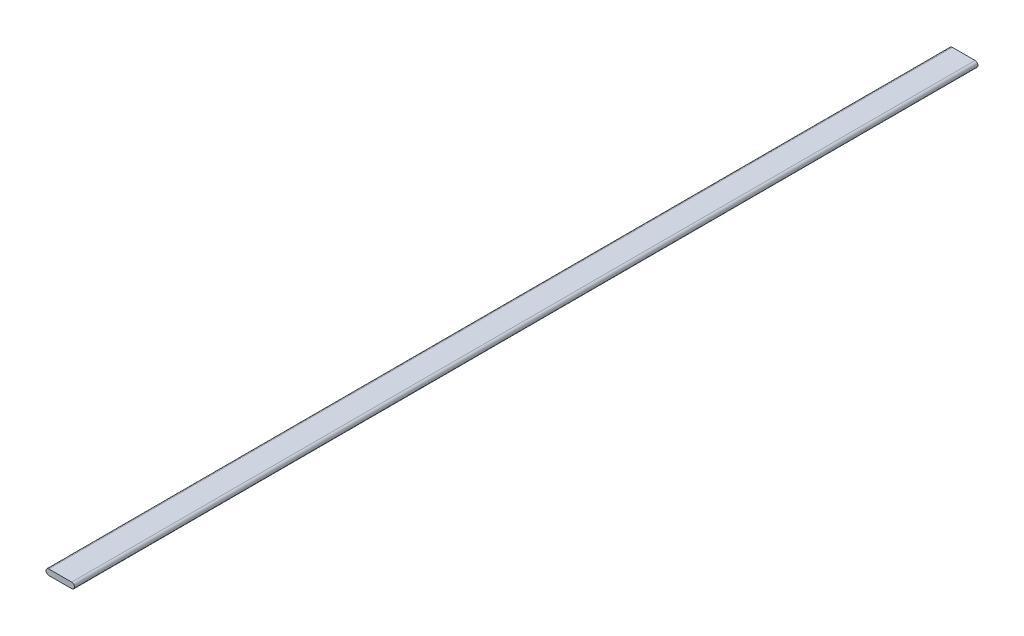
ISO-10303-21;
HEADER;
FILE_DESCRIPTION(('STEP AP214'),'2;1');
FILE_NAME('part.step','',(''),(''),'','','');
FILE_SCHEMA(('AUTOMOTIVE_DESIGN { 1 0 10303 214 1 1 1 1 }'));
ENDSEC;
DATA;
#1=APPLICATION_CONTEXT('core data for automotive mechanical design processes');
#2=APPLICATION_PROTOCOL_DEFINITION('international standard','automotive_design',2000,#1);
#3=PRODUCT_CONTEXT('',#1,'mechanical');
#4=PRODUCT('Part','Part','',(#3));
#5=PRODUCT_RELATED_PRODUCT_CATEGORY('part','',(#4));
#6=PRODUCT_DEFINITION_FORMATION('','',#4);
#7=PRODUCT_DEFINITION_CONTEXT('part definition',#1,'design');
#8=PRODUCT_DEFINITION('design','',#6,#7);
#9=PRODUCT_DEFINITION_SHAPE('','',#8);
#10=(LENGTH_UNIT() NAMED_UNIT(*) SI_UNIT(.MILLI.,.METRE.));
#11=(NAMED_UNIT(*) PLANE_ANGLE_UNIT() SI_UNIT($,.RADIAN.));
#12=(NAMED_UNIT(*) SI_UNIT($,.STERADIAN.) SOLID_ANGLE_UNIT());
#13=UNCERTAINTY_MEASURE_WITH_UNIT(LENGTH_MEASURE(1.E-05),#10,'distance_accuracy_value','');
#14=(GEOMETRIC_REPRESENTATION_CONTEXT(3) GLOBAL_UNCERTAINTY_ASSIGNED_CONTEXT((#13)) GLOBAL_UNIT_ASSIGNED_CONTEXT((#10,
#11,#12)) REPRESENTATION_CONTEXT('',''));
#15=CARTESIAN_POINT('',(0.,0.,0.));
#16=DIRECTION('',(0.,0.,1.));
#17=DIRECTION('',(1.,0.,0.));
#18=AXIS2_PLACEMENT_3D('',#15,#16,#17);
#19=CARTESIAN_POINT('',(-1.016,0.,-40.259));
#20=DIRECTION('',(0.,0.,1.));
#21=DIRECTION('',(1.,0.,0.));
#22=AXIS2_PLACEMENT_3D('',#19,#20,#21);
#23=CYLINDRICAL_SURFACE('',#22,0.254);
#24=DIRECTION('',(0.,0.,1.));
#25=VECTOR('',#24,1.);
#26=CARTESIAN_POINT('',(-1.016,-0.254,-40.259));
#27=LINE('',#26,#25);
#28=CARTESIAN_POINT('',(-1.016,-0.254,-40.259));
#29=VERTEX_POINT('',#28);
#30=CARTESIAN_POINT('',(-1.016,-0.254,40.259));
#31=VERTEX_POINT('',#30);
#32=EDGE_CURVE('E37',#29,#31,#27,.T.);
#33=ORIENTED_EDGE('',*,*,#32,.T.);
#34=CARTESIAN_POINT('',(-1.016,0.,40.259));
#35=DIRECTION('',(0.,0.,1.));
#36=DIRECTION('',(1.,0.,0.));
#37=AXIS2_PLACEMENT_3D('',#34,#35,#36);
#38=CIRCLE('',#37,0.254);
#39=CARTESIAN_POINT('',(-1.016,0.254,40.259));
#40=VERTEX_POINT('',#39);
#41=EDGE_CURVE('E74',#40,#31,#38,.T.);
#42=ORIENTED_EDGE('',*,*,#41,.F.);
#43=DIRECTION('',(0.,0.,1.));
#44=VECTOR('',#43,1.);
#45=CARTESIAN_POINT('',(-1.016,0.254,-40.259));
#46=LINE('',#45,#44);
#47=CARTESIAN_POINT('',(-1.016,0.254,-40.259));
#48=VERTEX_POINT('',#47);
#49=EDGE_CURVE('E11',#48,#40,#46,.T.);
#50=ORIENTED_EDGE('',*,*,#49,.F.);
#51=CARTESIAN_POINT('',(-1.016,0.,-40.259));
#52=DIRECTION('',(0.,0.,1.));
#53=DIRECTION('',(1.,0.,0.));
#54=AXIS2_PLACEMENT_3D('',#51,#52,#53);
#55=CIRCLE('',#54,0.254);
#56=EDGE_CURVE('E75',#48,#29,#55,.T.);
#57=ORIENTED_EDGE('',*,*,#56,.T.);
#58=EDGE_LOOP('',(#33,#42,#50,#57));
#59=FACE_BOUND('',#58,.T.);
#60=ADVANCED_FACE('F34',(#59),#23,.T.);
#61=CARTESIAN_POINT('',(-1.016,0.254,-40.259));
#62=DIRECTION('',(0.,1.,0.));
#63=DIRECTION('',(-1.,0.,0.));
#64=AXIS2_PLACEMENT_3D('',#61,#62,#63);
#65=PLANE('',#64);
#66=ORIENTED_EDGE('',*,*,#49,.T.);
#67=DIRECTION('',(-1.,0.,0.));
#68=VECTOR('',#67,1.);
#69=CARTESIAN_POINT('',(-1.016,0.254,40.259));
#70=LINE('',#69,#68);
#71=CARTESIAN_POINT('',(1.016,0.254,40.259));
#72=VERTEX_POINT('',#71);
#73=EDGE_CURVE('E91',#72,#40,#70,.T.);
#74=ORIENTED_EDGE('',*,*,#73,.F.);
#75=DIRECTION('',(0.,0.,1.));
#76=VECTOR('',#75,1.);
#77=CARTESIAN_POINT('',(1.016,0.254,-40.259));
#78=LINE('',#77,#76);
#79=CARTESIAN_POINT('',(1.016,0.254,-40.259));
#80=VERTEX_POINT('',#79);
#81=EDGE_CURVE('E42',#80,#72,#78,.T.);
#82=ORIENTED_EDGE('',*,*,#81,.F.);
#83=DIRECTION('',(-1.,0.,0.));
#84=VECTOR('',#83,1.);
#85=CARTESIAN_POINT('',(-1.016,0.254,-40.259));
#86=LINE('',#85,#84);
#87=EDGE_CURVE('E80',#80,#48,#86,.T.);
#88=ORIENTED_EDGE('',*,*,#87,.T.);
#89=EDGE_LOOP('',(#66,#74,#82,#88));
#90=FACE_BOUND('',#89,.T.);
#91=ADVANCED_FACE('F106',(#90),#65,.T.);
#92=CARTESIAN_POINT('',(1.016,0.,-40.259));
#93=DIRECTION('',(0.,0.,1.));
#94=DIRECTION('',(1.,0.,0.));
#95=AXIS2_PLACEMENT_3D('',#92,#93,#94);
#96=CYLINDRICAL_SURFACE('',#95,0.254);
#97=ORIENTED_EDGE('',*,*,#81,.T.);
#98=CARTESIAN_POINT('',(1.016,0.,40.259));
#99=DIRECTION('',(0.,0.,1.));
#100=DIRECTION('',(1.,0.,0.));
#101=AXIS2_PLACEMENT_3D('',#98,#99,#100);
#102=CIRCLE('',#101,0.254);
#103=CARTESIAN_POINT('',(1.016,-0.254,40.259));
#104=VERTEX_POINT('',#103);
#105=EDGE_CURVE('E87',#104,#72,#102,.T.);
#106=ORIENTED_EDGE('',*,*,#105,.F.);
#107=DIRECTION('',(0.,0.,1.));
#108=VECTOR('',#107,1.);
#109=CARTESIAN_POINT('',(1.016,-0.254,-40.259));
#110=LINE('',#109,#108);
#111=CARTESIAN_POINT('',(1.016,-0.254,-40.259));
#112=VERTEX_POINT('',#111);
#113=EDGE_CURVE('E79',#112,#104,#110,.T.);
#114=ORIENTED_EDGE('',*,*,#113,.F.);
#115=CARTESIAN_POINT('',(1.016,0.,-40.259));
#116=DIRECTION('',(0.,0.,1.));
#117=DIRECTION('',(1.,0.,0.));
#118=AXIS2_PLACEMENT_3D('',#115,#116,#117);
#119=CIRCLE('',#118,0.254);
#120=EDGE_CURVE('E99',#112,#80,#119,.T.);
#121=ORIENTED_EDGE('',*,*,#120,.T.);
#122=EDGE_LOOP('',(#97,#106,#114,#121));
#123=FACE_BOUND('',#122,.T.);
#124=ADVANCED_FACE('F103',(#123),#96,.T.);
#125=CARTESIAN_POINT('',(-1.016,-0.254,-40.259));
#126=DIRECTION('',(0.,-1.,0.));
#127=DIRECTION('',(1.,0.,0.));
#128=AXIS2_PLACEMENT_3D('',#125,#126,#127);
#129=PLANE('',#128);
#130=ORIENTED_EDGE('',*,*,#113,.T.);
#131=DIRECTION('',(1.,0.,0.));
#132=VECTOR('',#131,1.);
#133=CARTESIAN_POINT('',(-1.016,-0.254,40.259));
#134=LINE('',#133,#132);
#135=EDGE_CURVE('E82',#31,#104,#134,.T.);
#136=ORIENTED_EDGE('',*,*,#135,.F.);
#137=ORIENTED_EDGE('',*,*,#32,.F.);
#138=DIRECTION('',(1.,0.,0.));
#139=VECTOR('',#138,1.);
#140=CARTESIAN_POINT('',(-1.016,-0.254,-40.259));
#141=LINE('',#140,#139);
#142=EDGE_CURVE('E97',#29,#112,#141,.T.);
#143=ORIENTED_EDGE('',*,*,#142,.T.);
#144=EDGE_LOOP('',(#130,#136,#137,#143));
#145=FACE_BOUND('',#144,.T.);
#146=ADVANCED_FACE('F83',(#145),#129,.T.);
#147=CARTESIAN_POINT('',(-1.016,0.,-40.259));
#148=DIRECTION('',(0.,0.,1.));
#149=DIRECTION('',(1.,0.,0.));
#150=AXIS2_PLACEMENT_3D('',#147,#148,#149);
#151=PLANE('',#150);
#152=ORIENTED_EDGE('',*,*,#56,.F.);
#153=ORIENTED_EDGE('',*,*,#87,.F.);
#154=ORIENTED_EDGE('',*,*,#120,.F.);
#155=ORIENTED_EDGE('',*,*,#142,.F.);
#156=EDGE_LOOP('',(#152,#153,#154,#155));
#157=FACE_BOUND('',#156,.T.);
#158=ADVANCED_FACE('F108',(#157),#151,.F.);
#159=CARTESIAN_POINT('',(-1.016,0.,40.259));
#160=DIRECTION('',(0.,0.,1.));
#161=DIRECTION('',(1.,0.,0.));
#162=AXIS2_PLACEMENT_3D('',#159,#160,#161);
#163=PLANE('',#162);
#164=ORIENTED_EDGE('',*,*,#41,.T.);
#165=ORIENTED_EDGE('',*,*,#135,.T.);
#166=ORIENTED_EDGE('',*,*,#105,.T.);
#167=ORIENTED_EDGE('',*,*,#73,.T.);
#168=EDGE_LOOP('',(#164,#165,#166,#167));
#169=FACE_BOUND('',#168,.T.);
#170=ADVANCED_FACE('F90',(#169),#163,.T.);
#171=CLOSED_SHELL('',(#60,#91,#124,#146,#158,#170));
#172=MANIFOLD_SOLID_BREP('B2',#171);
#173=ADVANCED_BREP_SHAPE_REPRESENTATION('',(#18,#172),#14);
#174=SHAPE_DEFINITION_REPRESENTATION(#9,#173);
ENDSEC;
END-ISO-10303-21;
